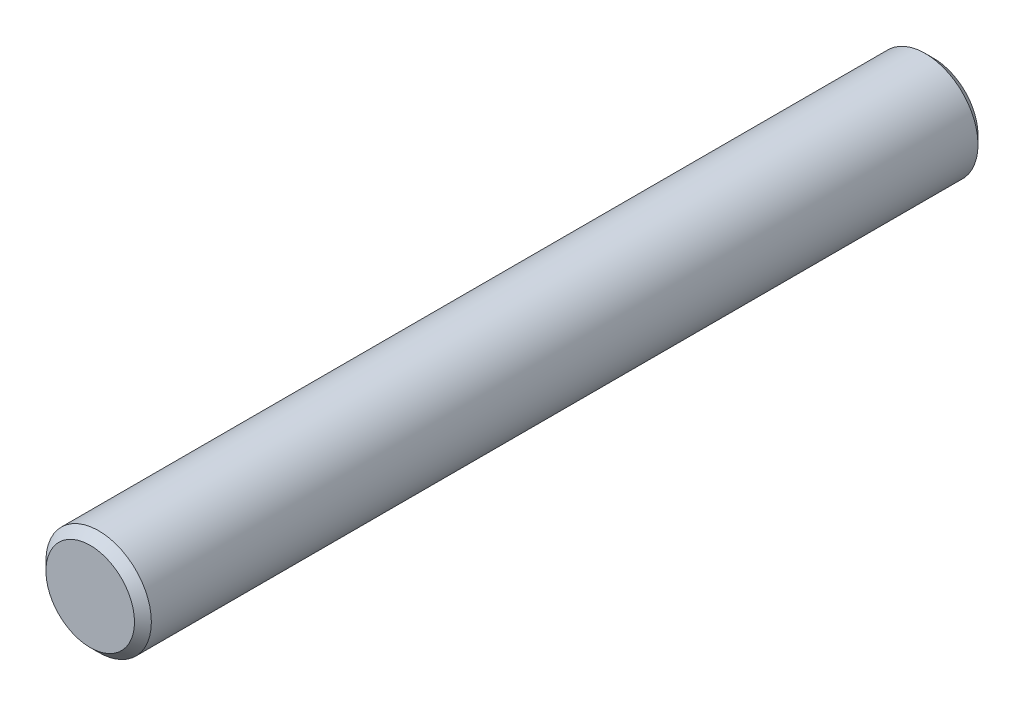
ISO-10303-21;
HEADER;
FILE_DESCRIPTION(('STEP AP214'),'2;1');
FILE_NAME('part.step','',(''),(''),'','','');
FILE_SCHEMA(('AUTOMOTIVE_DESIGN { 1 0 10303 214 1 1 1 1 }'));
ENDSEC;
DATA;
#1=APPLICATION_CONTEXT('core data for automotive mechanical design processes');
#2=APPLICATION_PROTOCOL_DEFINITION('international standard','automotive_design',2000,#1);
#3=PRODUCT_CONTEXT('',#1,'mechanical');
#4=PRODUCT('Part','Part','',(#3));
#5=PRODUCT_RELATED_PRODUCT_CATEGORY('part','',(#4));
#6=PRODUCT_DEFINITION_FORMATION('','',#4);
#7=PRODUCT_DEFINITION_CONTEXT('part definition',#1,'design');
#8=PRODUCT_DEFINITION('design','',#6,#7);
#9=PRODUCT_DEFINITION_SHAPE('','',#8);
#10=(LENGTH_UNIT() NAMED_UNIT(*) SI_UNIT(.MILLI.,.METRE.));
#11=(NAMED_UNIT(*) PLANE_ANGLE_UNIT() SI_UNIT($,.RADIAN.));
#12=(NAMED_UNIT(*) SI_UNIT($,.STERADIAN.) SOLID_ANGLE_UNIT());
#13=UNCERTAINTY_MEASURE_WITH_UNIT(LENGTH_MEASURE(1.E-05),#10,'distance_accuracy_value','');
#14=(GEOMETRIC_REPRESENTATION_CONTEXT(3) GLOBAL_UNCERTAINTY_ASSIGNED_CONTEXT((#13)) GLOBAL_UNIT_ASSIGNED_CONTEXT((#10,
#11,#12)) REPRESENTATION_CONTEXT('',''));
#15=CARTESIAN_POINT('',(0.,0.,0.));
#16=DIRECTION('',(0.,0.,1.));
#17=DIRECTION('',(1.,0.,0.));
#18=AXIS2_PLACEMENT_3D('',#15,#16,#17);
#19=CARTESIAN_POINT('',(0.,0.,200.));
#20=DIRECTION('',(0.,0.,-1.));
#21=DIRECTION('',(-1.,0.,0.));
#22=AXIS2_PLACEMENT_3D('',#19,#20,#21);
#23=CYLINDRICAL_SURFACE('',#22,12.5);
#24=CARTESIAN_POINT('',(0.,0.,198.));
#25=DIRECTION('',(0.,0.,1.));
#26=DIRECTION('',(1.,0.,0.));
#27=AXIS2_PLACEMENT_3D('',#24,#25,#26);
#28=CIRCLE('',#27,12.5);
#29=CARTESIAN_POINT('',(12.5,0.,198.));
#30=VERTEX_POINT('',#29);
#31=EDGE_CURVE('E10',#30,#30,#28,.F.);
#32=ORIENTED_EDGE('',*,*,#31,.T.);
#33=EDGE_LOOP('',(#32));
#34=FACE_BOUND('',#33,.T.);
#35=CARTESIAN_POINT('',(0.,0.,2.00000000000003));
#36=DIRECTION('',(0.,0.,1.));
#37=DIRECTION('',(1.,0.,0.));
#38=AXIS2_PLACEMENT_3D('',#35,#36,#37);
#39=CIRCLE('',#38,12.5);
#40=CARTESIAN_POINT('',(12.5,0.,2.00000000000003));
#41=VERTEX_POINT('',#40);
#42=EDGE_CURVE('E53',#41,#41,#39,.T.);
#43=ORIENTED_EDGE('',*,*,#42,.T.);
#44=EDGE_LOOP('',(#43));
#45=FACE_BOUND('',#44,.T.);
#46=ADVANCED_FACE('F37',(#34,#45),#23,.T.);
#47=CARTESIAN_POINT('',(0.,0.,200.));
#48=DIRECTION('',(0.,0.,1.));
#49=DIRECTION('',(1.,0.,0.));
#50=AXIS2_PLACEMENT_3D('',#47,#48,#49);
#51=PLANE('',#50);
#52=CARTESIAN_POINT('',(0.,0.,200.));
#53=DIRECTION('',(0.,0.,1.));
#54=DIRECTION('',(1.,0.,0.));
#55=AXIS2_PLACEMENT_3D('',#52,#53,#54);
#56=CIRCLE('',#55,10.5);
#57=CARTESIAN_POINT('',(10.5,0.,200.));
#58=VERTEX_POINT('',#57);
#59=EDGE_CURVE('E45',#58,#58,#56,.T.);
#60=ORIENTED_EDGE('',*,*,#59,.T.);
#61=EDGE_LOOP('',(#60));
#62=FACE_BOUND('',#61,.T.);
#63=ADVANCED_FACE('F69',(#62),#51,.T.);
#64=CARTESIAN_POINT('',(0.,0.,0.));
#65=DIRECTION('',(0.,0.,1.));
#66=DIRECTION('',(1.,0.,0.));
#67=AXIS2_PLACEMENT_3D('',#64,#65,#66);
#68=PLANE('',#67);
#69=CARTESIAN_POINT('',(0.,0.,0.));
#70=DIRECTION('',(0.,0.,1.));
#71=DIRECTION('',(1.,0.,0.));
#72=AXIS2_PLACEMENT_3D('',#69,#70,#71);
#73=CIRCLE('',#72,10.5);
#74=CARTESIAN_POINT('',(10.5,0.,0.));
#75=VERTEX_POINT('',#74);
#76=EDGE_CURVE('E49',#75,#75,#73,.F.);
#77=ORIENTED_EDGE('',*,*,#76,.T.);
#78=EDGE_LOOP('',(#77));
#79=FACE_BOUND('',#78,.T.);
#80=ADVANCED_FACE('F62',(#79),#68,.F.);
#81=CARTESIAN_POINT('',(0.,0.,2.00000000000003));
#82=DIRECTION('',(0.,0.,1.));
#83=DIRECTION('',(1.,0.,0.));
#84=AXIS2_PLACEMENT_3D('',#81,#82,#83);
#85=CONICAL_SURFACE('',#84,12.5,0.785398163397446);
#86=ORIENTED_EDGE('',*,*,#76,.F.);
#87=EDGE_LOOP('',(#86));
#88=FACE_BOUND('',#87,.T.);
#89=ORIENTED_EDGE('',*,*,#42,.F.);
#90=EDGE_LOOP('',(#89));
#91=FACE_BOUND('',#90,.T.);
#92=ADVANCED_FACE('F60',(#88,#91),#85,.T.);
#93=CARTESIAN_POINT('',(0.,0.,200.));
#94=DIRECTION('',(0.,0.,-1.));
#95=DIRECTION('',(-1.,0.,0.));
#96=AXIS2_PLACEMENT_3D('',#93,#94,#95);
#97=CONICAL_SURFACE('',#96,10.5,0.785398163397446);
#98=ORIENTED_EDGE('',*,*,#31,.F.);
#99=EDGE_LOOP('',(#98));
#100=FACE_BOUND('',#99,.T.);
#101=ORIENTED_EDGE('',*,*,#59,.F.);
#102=EDGE_LOOP('',(#101));
#103=FACE_BOUND('',#102,.T.);
#104=ADVANCED_FACE('F40',(#100,#103),#97,.T.);
#105=CLOSED_SHELL('',(#46,#63,#80,#92,#104));
#106=MANIFOLD_SOLID_BREP('B2',#105);
#107=ADVANCED_BREP_SHAPE_REPRESENTATION('',(#18,#106),#14);
#108=SHAPE_DEFINITION_REPRESENTATION(#9,#107);
ENDSEC;
END-ISO-10303-21;
